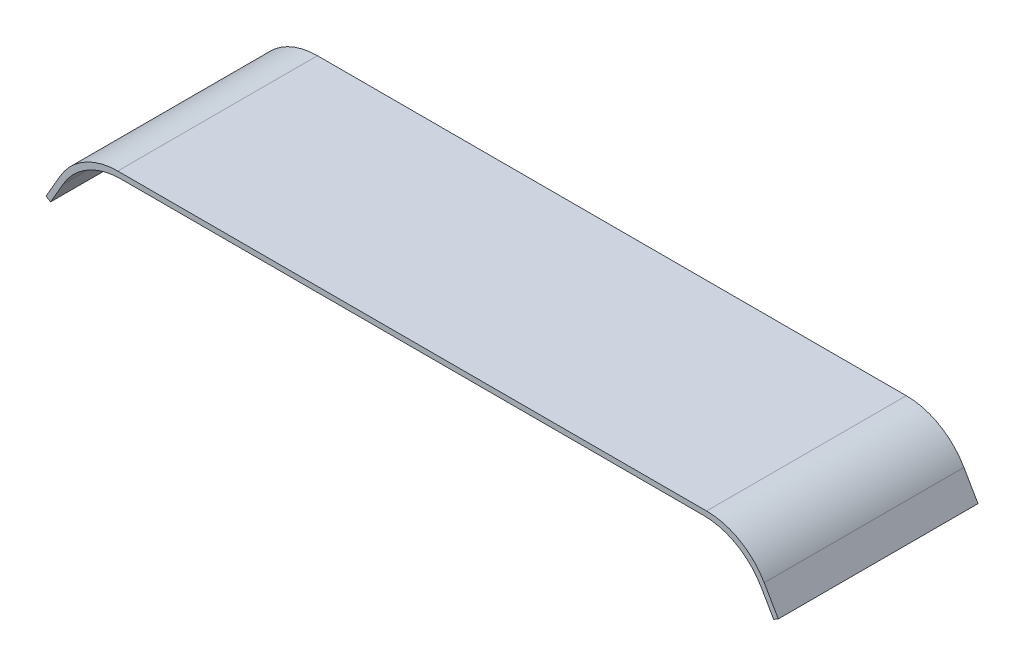
ISO-10303-21;
HEADER;
FILE_DESCRIPTION(('STEP AP214'),'2;1');
FILE_NAME('part.step','',(''),(''),'','','');
FILE_SCHEMA(('AUTOMOTIVE_DESIGN { 1 0 10303 214 1 1 1 1 }'));
ENDSEC;
DATA;
#1=APPLICATION_CONTEXT('core data for automotive mechanical design processes');
#2=APPLICATION_PROTOCOL_DEFINITION('international standard','automotive_design',2000,#1);
#3=PRODUCT_CONTEXT('',#1,'mechanical');
#4=PRODUCT('Part','Part','',(#3));
#5=PRODUCT_RELATED_PRODUCT_CATEGORY('part','',(#4));
#6=PRODUCT_DEFINITION_FORMATION('','',#4);
#7=PRODUCT_DEFINITION_CONTEXT('part definition',#1,'design');
#8=PRODUCT_DEFINITION('design','',#6,#7);
#9=PRODUCT_DEFINITION_SHAPE('','',#8);
#10=(LENGTH_UNIT() NAMED_UNIT(*) SI_UNIT(.MILLI.,.METRE.));
#11=(NAMED_UNIT(*) PLANE_ANGLE_UNIT() SI_UNIT($,.RADIAN.));
#12=(NAMED_UNIT(*) SI_UNIT($,.STERADIAN.) SOLID_ANGLE_UNIT());
#13=UNCERTAINTY_MEASURE_WITH_UNIT(LENGTH_MEASURE(1.E-05),#10,'distance_accuracy_value','');
#14=(GEOMETRIC_REPRESENTATION_CONTEXT(3) GLOBAL_UNCERTAINTY_ASSIGNED_CONTEXT((#13)) GLOBAL_UNIT_ASSIGNED_CONTEXT((#10,
#11,#12)) REPRESENTATION_CONTEXT('',''));
#15=CARTESIAN_POINT('',(0.,0.,0.));
#16=DIRECTION('',(0.,0.,1.));
#17=DIRECTION('',(1.,0.,0.));
#18=AXIS2_PLACEMENT_3D('',#15,#16,#17);
#19=CARTESIAN_POINT('',(-0.0692820323027552,0.0399999999999998,3.));
#20=DIRECTION('',(0.499999999999998,0.86602540378444,0.));
#21=DIRECTION('',(-0.86602540378444,0.499999999999998,0.));
#22=AXIS2_PLACEMENT_3D('',#19,#20,#21);
#23=PLANE('',#22);
#24=DIRECTION('',(0.86602540378444,-0.499999999999997,0.));
#25=VECTOR('',#24,1.);
#26=CARTESIAN_POINT('',(-0.0692820323027552,0.0399999999999998,0.));
#27=LINE('',#26,#25);
#28=CARTESIAN_POINT('',(-0.0692820323027552,0.0399999999999998,0.));
#29=VERTEX_POINT('',#28);
#30=CARTESIAN_POINT('',(0.,0.,0.));
#31=VERTEX_POINT('',#30);
#32=EDGE_CURVE('E147',#29,#31,#27,.T.);
#33=ORIENTED_EDGE('',*,*,#32,.T.);
#34=DIRECTION('',(0.,0.,-1.));
#35=VECTOR('',#34,1.);
#36=CARTESIAN_POINT('',(0.,0.,3.));
#37=LINE('',#36,#35);
#38=CARTESIAN_POINT('',(0.,0.,3.));
#39=VERTEX_POINT('',#38);
#40=EDGE_CURVE('E128',#39,#31,#37,.T.);
#41=ORIENTED_EDGE('',*,*,#40,.F.);
#42=DIRECTION('',(0.86602540378444,-0.499999999999997,0.));
#43=VECTOR('',#42,1.);
#44=CARTESIAN_POINT('',(-0.0692820323027552,0.0399999999999998,3.));
#45=LINE('',#44,#43);
#46=CARTESIAN_POINT('',(-0.0692820323027552,0.0399999999999998,3.));
#47=VERTEX_POINT('',#46);
#48=EDGE_CURVE('E134',#47,#39,#45,.T.);
#49=ORIENTED_EDGE('',*,*,#48,.F.);
#50=DIRECTION('',(0.,0.,-1.));
#51=VECTOR('',#50,1.);
#52=CARTESIAN_POINT('',(-0.0692820323027552,0.0399999999999998,3.));
#53=LINE('',#52,#51);
#54=EDGE_CURVE('E219',#47,#29,#53,.T.);
#55=ORIENTED_EDGE('',*,*,#54,.T.);
#56=EDGE_LOOP('',(#33,#41,#49,#55));
#57=FACE_BOUND('',#56,.T.);
#58=ADVANCED_FACE('F33',(#57),#23,.F.);
#59=CARTESIAN_POINT('',(0.,0.,3.));
#60=DIRECTION('',(-0.86602540378444,0.499999999999998,0.));
#61=DIRECTION('',(-0.499999999999998,-0.86602540378444,0.));
#62=AXIS2_PLACEMENT_3D('',#59,#60,#61);
#63=PLANE('',#62);
#64=DIRECTION('',(0.499999999999998,0.86602540378444,0.));
#65=VECTOR('',#64,1.);
#66=CARTESIAN_POINT('',(0.,0.,0.));
#67=LINE('',#66,#65);
#68=CARTESIAN_POINT('',(0.1882308546376,0.326025403784438,0.));
#69=VERTEX_POINT('',#68);
#70=EDGE_CURVE('E224',#31,#69,#67,.T.);
#71=ORIENTED_EDGE('',*,*,#70,.T.);
#72=DIRECTION('',(0.,0.,-1.));
#73=VECTOR('',#72,1.);
#74=CARTESIAN_POINT('',(0.188230854637601,0.326025403784438,3.));
#75=LINE('',#74,#73);
#76=CARTESIAN_POINT('',(0.1882308546376,0.326025403784438,3.));
#77=VERTEX_POINT('',#76);
#78=EDGE_CURVE('E131',#69,#77,#75,.F.);
#79=ORIENTED_EDGE('',*,*,#78,.T.);
#80=DIRECTION('',(0.499999999999998,0.86602540378444,0.));
#81=VECTOR('',#80,1.);
#82=CARTESIAN_POINT('',(0.,0.,3.));
#83=LINE('',#82,#81);
#84=EDGE_CURVE('E123',#39,#77,#83,.T.);
#85=ORIENTED_EDGE('',*,*,#84,.F.);
#86=ORIENTED_EDGE('',*,*,#40,.T.);
#87=EDGE_LOOP('',(#71,#79,#85,#86));
#88=FACE_BOUND('',#87,.T.);
#89=ADVANCED_FACE('F126',(#88),#63,.F.);
#90=CARTESIAN_POINT('',(0.476905989232413,0.82602540378444,3.));
#91=DIRECTION('',(0.,1.,0.));
#92=DIRECTION('',(0.,0.,1.));
#93=AXIS2_PLACEMENT_3D('',#90,#91,#92);
#94=PLANE('',#93);
#95=DIRECTION('',(1.,0.,0.));
#96=VECTOR('',#95,1.);
#97=CARTESIAN_POINT('',(0.476905989232413,0.82602540378444,3.));
#98=LINE('',#97,#96);
#99=CARTESIAN_POINT('',(1.05425625842204,0.82602540378444,3.));
#100=VERTEX_POINT('',#99);
#101=CARTESIAN_POINT('',(9.80717967697245,0.82602540378444,3.));
#102=VERTEX_POINT('',#101);
#103=EDGE_CURVE('E133',#100,#102,#98,.T.);
#104=ORIENTED_EDGE('',*,*,#103,.F.);
#105=DIRECTION('',(0.,0.,-1.));
#106=VECTOR('',#105,1.);
#107=CARTESIAN_POINT('',(1.05425625842204,0.82602540378444,0.));
#108=LINE('',#107,#106);
#109=CARTESIAN_POINT('',(1.05425625842204,0.82602540378444,0.));
#110=VERTEX_POINT('',#109);
#111=EDGE_CURVE('E151',#100,#110,#108,.T.);
#112=ORIENTED_EDGE('',*,*,#111,.T.);
#113=DIRECTION('',(1.,0.,0.));
#114=VECTOR('',#113,1.);
#115=CARTESIAN_POINT('',(0.476905989232413,0.82602540378444,0.));
#116=LINE('',#115,#114);
#117=CARTESIAN_POINT('',(9.80717967697245,0.82602540378444,0.));
#118=VERTEX_POINT('',#117);
#119=EDGE_CURVE('E226',#110,#118,#116,.T.);
#120=ORIENTED_EDGE('',*,*,#119,.T.);
#121=DIRECTION('',(0.,0.,-1.));
#122=VECTOR('',#121,1.);
#123=CARTESIAN_POINT('',(9.80717967697245,0.82602540378444,3.));
#124=LINE('',#123,#122);
#125=EDGE_CURVE('E148',#118,#102,#124,.F.);
#126=ORIENTED_EDGE('',*,*,#125,.T.);
#127=EDGE_LOOP('',(#104,#112,#120,#126));
#128=FACE_BOUND('',#127,.T.);
#129=ADVANCED_FACE('F243',(#128),#94,.F.);
#130=CARTESIAN_POINT('',(10.3845299461621,0.82602540378444,3.));
#131=DIRECTION('',(0.86602540378444,0.499999999999998,0.));
#132=DIRECTION('',(-0.499999999999998,0.86602540378444,0.));
#133=AXIS2_PLACEMENT_3D('',#130,#131,#132);
#134=PLANE('',#133);
#135=DIRECTION('',(0.499999999999998,-0.866025403784439,0.));
#136=VECTOR('',#135,1.);
#137=CARTESIAN_POINT('',(10.3845299461621,0.82602540378444,3.));
#138=LINE('',#137,#136);
#139=CARTESIAN_POINT('',(10.6732050807569,0.326025403784438,3.));
#140=VERTEX_POINT('',#139);
#141=CARTESIAN_POINT('',(10.8614359353945,0.,3.));
#142=VERTEX_POINT('',#141);
#143=EDGE_CURVE('E236',#140,#142,#138,.T.);
#144=ORIENTED_EDGE('',*,*,#143,.F.);
#145=DIRECTION('',(0.,0.,-1.));
#146=VECTOR('',#145,1.);
#147=CARTESIAN_POINT('',(10.6732050807569,0.326025403784438,0.));
#148=LINE('',#147,#146);
#149=CARTESIAN_POINT('',(10.6732050807569,0.326025403784438,0.));
#150=VERTEX_POINT('',#149);
#151=EDGE_CURVE('E171',#140,#150,#148,.T.);
#152=ORIENTED_EDGE('',*,*,#151,.T.);
#153=DIRECTION('',(0.499999999999998,-0.866025403784439,0.));
#154=VECTOR('',#153,1.);
#155=CARTESIAN_POINT('',(10.3845299461621,0.82602540378444,0.));
#156=LINE('',#155,#154);
#157=CARTESIAN_POINT('',(10.8614359353945,0.,0.));
#158=VERTEX_POINT('',#157);
#159=EDGE_CURVE('E214',#150,#158,#156,.T.);
#160=ORIENTED_EDGE('',*,*,#159,.T.);
#161=DIRECTION('',(0.,0.,-1.));
#162=VECTOR('',#161,1.);
#163=CARTESIAN_POINT('',(10.8614359353945,0.,3.));
#164=LINE('',#163,#162);
#165=EDGE_CURVE('E149',#142,#158,#164,.T.);
#166=ORIENTED_EDGE('',*,*,#165,.F.);
#167=EDGE_LOOP('',(#144,#152,#160,#166));
#168=FACE_BOUND('',#167,.T.);
#169=ADVANCED_FACE('F231',(#168),#134,.F.);
#170=CARTESIAN_POINT('',(10.8614359353945,0.,3.));
#171=DIRECTION('',(-0.499999999999997,0.86602540378444,0.));
#172=DIRECTION('',(-0.86602540378444,-0.499999999999997,0.));
#173=AXIS2_PLACEMENT_3D('',#170,#171,#172);
#174=PLANE('',#173);
#175=DIRECTION('',(0.86602540378444,0.499999999999997,0.));
#176=VECTOR('',#175,1.);
#177=CARTESIAN_POINT('',(10.8614359353945,0.,0.));
#178=LINE('',#177,#176);
#179=CARTESIAN_POINT('',(10.9307179676972,0.040000000000002,0.));
#180=VERTEX_POINT('',#179);
#181=EDGE_CURVE('E211',#158,#180,#178,.T.);
#182=ORIENTED_EDGE('',*,*,#181,.T.);
#183=DIRECTION('',(0.,0.,-1.));
#184=VECTOR('',#183,1.);
#185=CARTESIAN_POINT('',(10.9307179676972,0.040000000000002,3.));
#186=LINE('',#185,#184);
#187=CARTESIAN_POINT('',(10.9307179676972,0.040000000000002,3.));
#188=VERTEX_POINT('',#187);
#189=EDGE_CURVE('E154',#188,#180,#186,.T.);
#190=ORIENTED_EDGE('',*,*,#189,.F.);
#191=DIRECTION('',(0.86602540378444,0.499999999999997,0.));
#192=VECTOR('',#191,1.);
#193=CARTESIAN_POINT('',(10.8614359353945,0.,3.));
#194=LINE('',#193,#192);
#195=EDGE_CURVE('E235',#142,#188,#194,.T.);
#196=ORIENTED_EDGE('',*,*,#195,.F.);
#197=ORIENTED_EDGE('',*,*,#165,.T.);
#198=EDGE_LOOP('',(#182,#190,#196,#197));
#199=FACE_BOUND('',#198,.T.);
#200=ADVANCED_FACE('F234',(#199),#174,.F.);
#201=CARTESIAN_POINT('',(10.9307179676972,0.040000000000002,3.));
#202=DIRECTION('',(-0.866025403784439,-0.499999999999999,0.));
#203=DIRECTION('',(0.499999999999999,-0.866025403784439,0.));
#204=AXIS2_PLACEMENT_3D('',#201,#202,#203);
#205=PLANE('',#204);
#206=DIRECTION('',(-0.499999999999999,0.866025403784439,0.));
#207=VECTOR('',#206,1.);
#208=CARTESIAN_POINT('',(10.9307179676972,0.040000000000002,0.));
#209=LINE('',#208,#207);
#210=CARTESIAN_POINT('',(10.7193931022921,0.40602540378444,0.));
#211=VERTEX_POINT('',#210);
#212=EDGE_CURVE('E205',#180,#211,#209,.T.);
#213=ORIENTED_EDGE('',*,*,#212,.T.);
#214=DIRECTION('',(0.,0.,-1.));
#215=VECTOR('',#214,1.);
#216=CARTESIAN_POINT('',(10.7193931022921,0.40602540378444,3.));
#217=LINE('',#216,#215);
#218=CARTESIAN_POINT('',(10.7193931022921,0.40602540378444,3.));
#219=VERTEX_POINT('',#218);
#220=EDGE_CURVE('E169',#211,#219,#217,.F.);
#221=ORIENTED_EDGE('',*,*,#220,.T.);
#222=DIRECTION('',(-0.499999999999999,0.866025403784439,0.));
#223=VECTOR('',#222,1.);
#224=CARTESIAN_POINT('',(10.9307179676972,0.040000000000002,3.));
#225=LINE('',#224,#223);
#226=EDGE_CURVE('E188',#188,#219,#225,.T.);
#227=ORIENTED_EDGE('',*,*,#226,.F.);
#228=ORIENTED_EDGE('',*,*,#189,.T.);
#229=EDGE_LOOP('',(#213,#221,#227,#228));
#230=FACE_BOUND('',#229,.T.);
#231=ADVANCED_FACE('F209',(#230),#205,.F.);
#232=CARTESIAN_POINT('',(10.4307179676972,0.906025403784441,3.));
#233=DIRECTION('',(0.,-1.,0.));
#234=DIRECTION('',(1.,0.,0.));
#235=AXIS2_PLACEMENT_3D('',#232,#233,#234);
#236=PLANE('',#235);
#237=DIRECTION('',(-1.,0.,0.));
#238=VECTOR('',#237,1.);
#239=CARTESIAN_POINT('',(10.4307179676972,0.906025403784441,0.));
#240=LINE('',#239,#238);
#241=CARTESIAN_POINT('',(9.85336769850762,0.906025403784441,0.));
#242=VERTEX_POINT('',#241);
#243=CARTESIAN_POINT('',(1.00806823688687,0.90602540378444,0.));
#244=VERTEX_POINT('',#243);
#245=EDGE_CURVE('E206',#242,#244,#240,.T.);
#246=ORIENTED_EDGE('',*,*,#245,.T.);
#247=DIRECTION('',(0.,0.,-1.));
#248=VECTOR('',#247,1.);
#249=CARTESIAN_POINT('',(1.00806823688687,0.90602540378444,3.));
#250=LINE('',#249,#248);
#251=CARTESIAN_POINT('',(1.00806823688687,0.90602540378444,3.));
#252=VERTEX_POINT('',#251);
#253=EDGE_CURVE('E167',#244,#252,#250,.F.);
#254=ORIENTED_EDGE('',*,*,#253,.T.);
#255=DIRECTION('',(-1.,0.,0.));
#256=VECTOR('',#255,1.);
#257=CARTESIAN_POINT('',(10.4307179676972,0.906025403784441,3.));
#258=LINE('',#257,#256);
#259=CARTESIAN_POINT('',(9.85336769850762,0.906025403784441,3.));
#260=VERTEX_POINT('',#259);
#261=EDGE_CURVE('E185',#260,#252,#258,.T.);
#262=ORIENTED_EDGE('',*,*,#261,.F.);
#263=DIRECTION('',(0.,0.,-1.));
#264=VECTOR('',#263,1.);
#265=CARTESIAN_POINT('',(9.85336769850762,0.906025403784441,3.));
#266=LINE('',#265,#264);
#267=EDGE_CURVE('E164',#260,#242,#266,.T.);
#268=ORIENTED_EDGE('',*,*,#267,.T.);
#269=EDGE_LOOP('',(#246,#254,#262,#268));
#270=FACE_BOUND('',#269,.T.);
#271=ADVANCED_FACE('F194',(#270),#236,.F.);
#272=CARTESIAN_POINT('',(0.430717967697242,0.90602540378444,3.));
#273=DIRECTION('',(0.86602540378444,-0.499999999999997,0.));
#274=DIRECTION('',(0.499999999999998,0.86602540378444,0.));
#275=AXIS2_PLACEMENT_3D('',#272,#273,#274);
#276=PLANE('',#275);
#277=DIRECTION('',(-0.499999999999998,-0.86602540378444,0.));
#278=VECTOR('',#277,1.);
#279=CARTESIAN_POINT('',(0.430717967697242,0.90602540378444,3.));
#280=LINE('',#279,#278);
#281=CARTESIAN_POINT('',(0.14204283310243,0.406025403784437,3.));
#282=VERTEX_POINT('',#281);
#283=EDGE_CURVE('E140',#282,#47,#280,.T.);
#284=ORIENTED_EDGE('',*,*,#283,.F.);
#285=DIRECTION('',(0.,0.,-1.));
#286=VECTOR('',#285,1.);
#287=CARTESIAN_POINT('',(0.14204283310243,0.406025403784438,3.));
#288=LINE('',#287,#286);
#289=CARTESIAN_POINT('',(0.14204283310243,0.406025403784437,0.));
#290=VERTEX_POINT('',#289);
#291=EDGE_CURVE('E161',#282,#290,#288,.T.);
#292=ORIENTED_EDGE('',*,*,#291,.T.);
#293=DIRECTION('',(-0.499999999999998,-0.86602540378444,0.));
#294=VECTOR('',#293,1.);
#295=CARTESIAN_POINT('',(0.430717967697242,0.90602540378444,0.));
#296=LINE('',#295,#294);
#297=EDGE_CURVE('E144',#290,#29,#296,.T.);
#298=ORIENTED_EDGE('',*,*,#297,.T.);
#299=ORIENTED_EDGE('',*,*,#54,.F.);
#300=EDGE_LOOP('',(#284,#292,#298,#299));
#301=FACE_BOUND('',#300,.T.);
#302=ADVANCED_FACE('F274',(#301),#276,.F.);
#303=CARTESIAN_POINT('',(0.,0.,3.));
#304=DIRECTION('',(0.,0.,1.));
#305=DIRECTION('',(1.,0.,0.));
#306=AXIS2_PLACEMENT_3D('',#303,#304,#305);
#307=PLANE('',#306);
#308=ORIENTED_EDGE('',*,*,#261,.T.);
#309=CARTESIAN_POINT('',(1.00806823688687,-0.0939745962155599,3.));
#310=DIRECTION('',(0.,0.,1.));
#311=DIRECTION('',(1.,0.,0.));
#312=AXIS2_PLACEMENT_3D('',#309,#310,#311);
#313=CIRCLE('',#312,1.);
#314=EDGE_CURVE('E11',#252,#282,#313,.T.);
#315=ORIENTED_EDGE('',*,*,#314,.T.);
#316=ORIENTED_EDGE('',*,*,#283,.T.);
#317=ORIENTED_EDGE('',*,*,#48,.T.);
#318=ORIENTED_EDGE('',*,*,#84,.T.);
#319=CARTESIAN_POINT('',(1.05425625842204,-0.17397459621556,3.));
#320=DIRECTION('',(0.,0.,1.));
#321=DIRECTION('',(1.,0.,0.));
#322=AXIS2_PLACEMENT_3D('',#319,#320,#321);
#323=CIRCLE('',#322,1.);
#324=EDGE_CURVE('E175',#77,#100,#323,.F.);
#325=ORIENTED_EDGE('',*,*,#324,.T.);
#326=ORIENTED_EDGE('',*,*,#103,.T.);
#327=CARTESIAN_POINT('',(9.80717967697245,-0.17397459621556,3.));
#328=DIRECTION('',(0.,0.,1.));
#329=DIRECTION('',(1.,0.,0.));
#330=AXIS2_PLACEMENT_3D('',#327,#328,#329);
#331=CIRCLE('',#330,1.);
#332=EDGE_CURVE('E48',#102,#140,#331,.F.);
#333=ORIENTED_EDGE('',*,*,#332,.T.);
#334=ORIENTED_EDGE('',*,*,#143,.T.);
#335=ORIENTED_EDGE('',*,*,#195,.T.);
#336=ORIENTED_EDGE('',*,*,#226,.T.);
#337=CARTESIAN_POINT('',(9.85336769850762,-0.0939745962155588,3.));
#338=DIRECTION('',(0.,0.,1.));
#339=DIRECTION('',(1.,0.,0.));
#340=AXIS2_PLACEMENT_3D('',#337,#338,#339);
#341=CIRCLE('',#340,1.);
#342=EDGE_CURVE('E41',#219,#260,#341,.T.);
#343=ORIENTED_EDGE('',*,*,#342,.T.);
#344=EDGE_LOOP('',(#308,#315,#316,#317,#318,#325,#326,#333,#334,#335,#336,#343));
#345=FACE_BOUND('',#344,.T.);
#346=ADVANCED_FACE('F138',(#345),#307,.T.);
#347=CARTESIAN_POINT('',(0.,0.,0.));
#348=DIRECTION('',(0.,0.,1.));
#349=DIRECTION('',(1.,0.,0.));
#350=AXIS2_PLACEMENT_3D('',#347,#348,#349);
#351=PLANE('',#350);
#352=ORIENTED_EDGE('',*,*,#297,.F.);
#353=CARTESIAN_POINT('',(1.00806823688687,-0.0939745962155599,0.));
#354=DIRECTION('',(0.,0.,1.));
#355=DIRECTION('',(1.,0.,0.));
#356=AXIS2_PLACEMENT_3D('',#353,#354,#355);
#357=CIRCLE('',#356,1.);
#358=EDGE_CURVE('E181',#290,#244,#357,.F.);
#359=ORIENTED_EDGE('',*,*,#358,.T.);
#360=ORIENTED_EDGE('',*,*,#245,.F.);
#361=CARTESIAN_POINT('',(9.85336769850762,-0.0939745962155588,0.));
#362=DIRECTION('',(0.,0.,1.));
#363=DIRECTION('',(1.,0.,0.));
#364=AXIS2_PLACEMENT_3D('',#361,#362,#363);
#365=CIRCLE('',#364,1.);
#366=EDGE_CURVE('E179',#242,#211,#365,.F.);
#367=ORIENTED_EDGE('',*,*,#366,.T.);
#368=ORIENTED_EDGE('',*,*,#212,.F.);
#369=ORIENTED_EDGE('',*,*,#181,.F.);
#370=ORIENTED_EDGE('',*,*,#159,.F.);
#371=CARTESIAN_POINT('',(9.80717967697245,-0.17397459621556,0.));
#372=DIRECTION('',(0.,0.,1.));
#373=DIRECTION('',(1.,0.,0.));
#374=AXIS2_PLACEMENT_3D('',#371,#372,#373);
#375=CIRCLE('',#374,1.);
#376=EDGE_CURVE('E56',#150,#118,#375,.T.);
#377=ORIENTED_EDGE('',*,*,#376,.T.);
#378=ORIENTED_EDGE('',*,*,#119,.F.);
#379=CARTESIAN_POINT('',(1.05425625842204,-0.17397459621556,0.));
#380=DIRECTION('',(0.,0.,1.));
#381=DIRECTION('',(1.,0.,0.));
#382=AXIS2_PLACEMENT_3D('',#379,#380,#381);
#383=CIRCLE('',#382,1.);
#384=EDGE_CURVE('E173',#110,#69,#383,.T.);
#385=ORIENTED_EDGE('',*,*,#384,.T.);
#386=ORIENTED_EDGE('',*,*,#70,.F.);
#387=ORIENTED_EDGE('',*,*,#32,.F.);
#388=EDGE_LOOP('',(#352,#359,#360,#367,#368,#369,#370,#377,#378,#385,#386,#387));
#389=FACE_BOUND('',#388,.T.);
#390=ADVANCED_FACE('F203',(#389),#351,.F.);
#391=CARTESIAN_POINT('',(1.05425625842204,-0.17397459621556,3.));
#392=DIRECTION('',(0.,0.,1.));
#393=DIRECTION('',(1.,0.,0.));
#394=AXIS2_PLACEMENT_3D('',#391,#392,#393);
#395=CYLINDRICAL_SURFACE('',#394,1.);
#396=ORIENTED_EDGE('',*,*,#324,.F.);
#397=ORIENTED_EDGE('',*,*,#78,.F.);
#398=ORIENTED_EDGE('',*,*,#384,.F.);
#399=ORIENTED_EDGE('',*,*,#111,.F.);
#400=EDGE_LOOP('',(#396,#397,#398,#399));
#401=FACE_BOUND('',#400,.T.);
#402=ADVANCED_FACE('F246',(#401),#395,.F.);
#403=CARTESIAN_POINT('',(1.00806823688687,-0.0939745962155599,3.));
#404=DIRECTION('',(0.,0.,-1.));
#405=DIRECTION('',(-1.,0.,0.));
#406=AXIS2_PLACEMENT_3D('',#403,#404,#405);
#407=CYLINDRICAL_SURFACE('',#406,1.);
#408=ORIENTED_EDGE('',*,*,#314,.F.);
#409=ORIENTED_EDGE('',*,*,#253,.F.);
#410=ORIENTED_EDGE('',*,*,#358,.F.);
#411=ORIENTED_EDGE('',*,*,#291,.F.);
#412=EDGE_LOOP('',(#408,#409,#410,#411));
#413=FACE_BOUND('',#412,.T.);
#414=ADVANCED_FACE('F248',(#413),#407,.T.);
#415=CARTESIAN_POINT('',(9.85336769850762,-0.0939745962155588,3.));
#416=DIRECTION('',(0.,0.,-1.));
#417=DIRECTION('',(-1.,0.,0.));
#418=AXIS2_PLACEMENT_3D('',#415,#416,#417);
#419=CYLINDRICAL_SURFACE('',#418,1.);
#420=ORIENTED_EDGE('',*,*,#342,.F.);
#421=ORIENTED_EDGE('',*,*,#220,.F.);
#422=ORIENTED_EDGE('',*,*,#366,.F.);
#423=ORIENTED_EDGE('',*,*,#267,.F.);
#424=EDGE_LOOP('',(#420,#421,#422,#423));
#425=FACE_BOUND('',#424,.T.);
#426=ADVANCED_FACE('F198',(#425),#419,.T.);
#427=CARTESIAN_POINT('',(9.80717967697245,-0.17397459621556,3.));
#428=DIRECTION('',(0.,0.,1.));
#429=DIRECTION('',(1.,0.,0.));
#430=AXIS2_PLACEMENT_3D('',#427,#428,#429);
#431=CYLINDRICAL_SURFACE('',#430,1.);
#432=ORIENTED_EDGE('',*,*,#332,.F.);
#433=ORIENTED_EDGE('',*,*,#125,.F.);
#434=ORIENTED_EDGE('',*,*,#376,.F.);
#435=ORIENTED_EDGE('',*,*,#151,.F.);
#436=EDGE_LOOP('',(#432,#433,#434,#435));
#437=FACE_BOUND('',#436,.T.);
#438=ADVANCED_FACE('F35',(#437),#431,.F.);
#439=CLOSED_SHELL('',(#58,#89,#129,#169,#200,#231,#271,#302,#346,#390,#402,#414,#426,#438));
#440=MANIFOLD_SOLID_BREP('B2',#439);
#441=ADVANCED_BREP_SHAPE_REPRESENTATION('',(#18,#440),#14);
#442=SHAPE_DEFINITION_REPRESENTATION(#9,#441);
ENDSEC;
END-ISO-10303-21;
